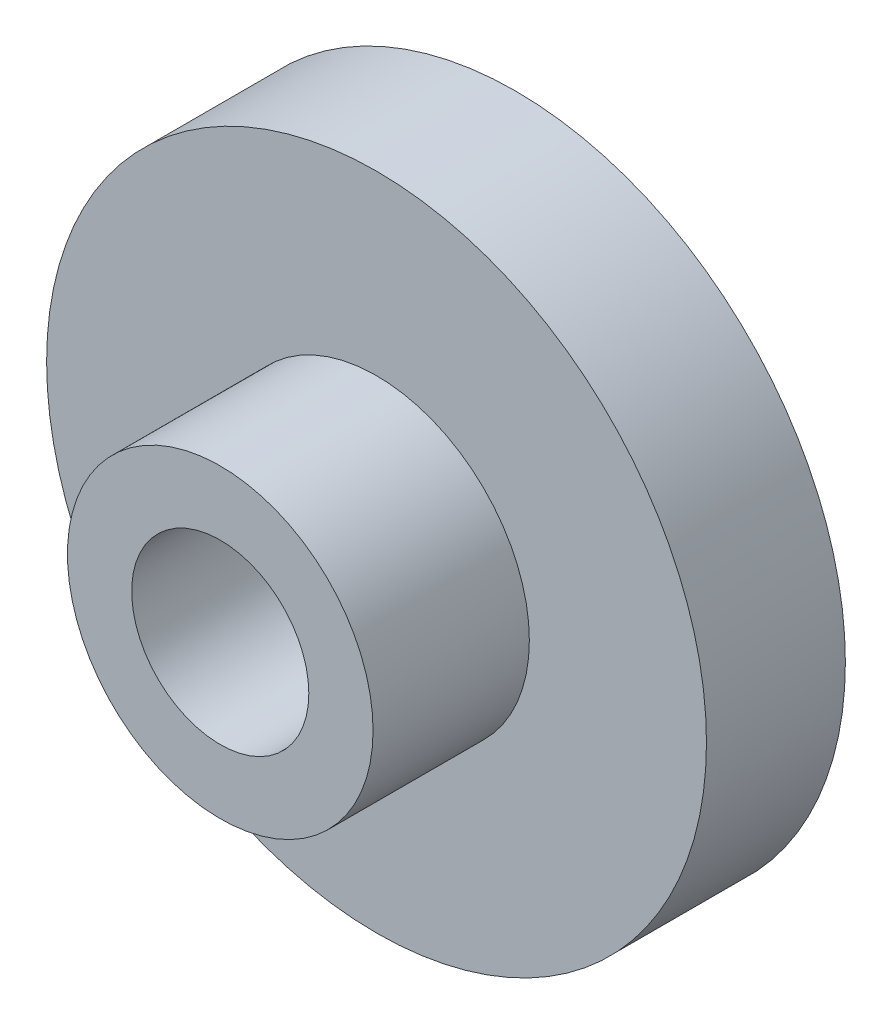
ISO-10303-21;
HEADER;
FILE_DESCRIPTION(('STEP AP214'),'2;1');
FILE_NAME('part.step','',(''),(''),'','','');
FILE_SCHEMA(('AUTOMOTIVE_DESIGN { 1 0 10303 214 1 1 1 1 }'));
ENDSEC;
DATA;
#1=APPLICATION_CONTEXT('core data for automotive mechanical design processes');
#2=APPLICATION_PROTOCOL_DEFINITION('international standard','automotive_design',2000,#1);
#3=PRODUCT_CONTEXT('',#1,'mechanical');
#4=PRODUCT('Part','Part','',(#3));
#5=PRODUCT_RELATED_PRODUCT_CATEGORY('part','',(#4));
#6=PRODUCT_DEFINITION_FORMATION('','',#4);
#7=PRODUCT_DEFINITION_CONTEXT('part definition',#1,'design');
#8=PRODUCT_DEFINITION('design','',#6,#7);
#9=PRODUCT_DEFINITION_SHAPE('','',#8);
#10=(LENGTH_UNIT() NAMED_UNIT(*) SI_UNIT(.MILLI.,.METRE.));
#11=(NAMED_UNIT(*) PLANE_ANGLE_UNIT() SI_UNIT($,.RADIAN.));
#12=(NAMED_UNIT(*) SI_UNIT($,.STERADIAN.) SOLID_ANGLE_UNIT());
#13=UNCERTAINTY_MEASURE_WITH_UNIT(LENGTH_MEASURE(1.E-05),#10,'distance_accuracy_value','');
#14=(GEOMETRIC_REPRESENTATION_CONTEXT(3) GLOBAL_UNCERTAINTY_ASSIGNED_CONTEXT((#13)) GLOBAL_UNIT_ASSIGNED_CONTEXT((#10,
#11,#12)) REPRESENTATION_CONTEXT('',''));
#15=CARTESIAN_POINT('',(0.,0.,0.));
#16=DIRECTION('',(0.,0.,1.));
#17=DIRECTION('',(1.,0.,0.));
#18=AXIS2_PLACEMENT_3D('',#15,#16,#17);
#19=CARTESIAN_POINT('',(0.,0.,2.));
#20=DIRECTION('',(0.,0.,-1.));
#21=DIRECTION('',(-1.,0.,0.));
#22=AXIS2_PLACEMENT_3D('',#19,#20,#21);
#23=CYLINDRICAL_SURFACE('',#22,4.75);
#24=CARTESIAN_POINT('',(0.,0.,2.));
#25=DIRECTION('',(0.,0.,1.));
#26=DIRECTION('',(1.,0.,0.));
#27=AXIS2_PLACEMENT_3D('',#24,#25,#26);
#28=CIRCLE('',#27,4.75);
#29=CARTESIAN_POINT('',(4.75,0.,2.));
#30=VERTEX_POINT('',#29);
#31=EDGE_CURVE('E52',#30,#30,#28,.T.);
#32=ORIENTED_EDGE('',*,*,#31,.F.);
#33=EDGE_LOOP('',(#32));
#34=FACE_BOUND('',#33,.T.);
#35=CARTESIAN_POINT('',(0.,0.,0.));
#36=DIRECTION('',(0.,0.,1.));
#37=DIRECTION('',(1.,0.,0.));
#38=AXIS2_PLACEMENT_3D('',#35,#36,#37);
#39=CIRCLE('',#38,4.75);
#40=CARTESIAN_POINT('',(4.75,0.,0.));
#41=VERTEX_POINT('',#40);
#42=EDGE_CURVE('E63',#41,#41,#39,.T.);
#43=ORIENTED_EDGE('',*,*,#42,.T.);
#44=EDGE_LOOP('',(#43));
#45=FACE_BOUND('',#44,.T.);
#46=ADVANCED_FACE('F45',(#34,#45),#23,.T.);
#47=CARTESIAN_POINT('',(0.,0.,2.));
#48=DIRECTION('',(0.,0.,1.));
#49=DIRECTION('',(1.,0.,0.));
#50=AXIS2_PLACEMENT_3D('',#47,#48,#49);
#51=PLANE('',#50);
#52=CARTESIAN_POINT('',(0.,0.,2.));
#53=DIRECTION('',(0.,0.,1.));
#54=DIRECTION('',(1.,0.,0.));
#55=AXIS2_PLACEMENT_3D('',#52,#53,#54);
#56=CIRCLE('',#55,2.2);
#57=CARTESIAN_POINT('',(2.2,0.,2.));
#58=VERTEX_POINT('',#57);
#59=EDGE_CURVE('E57',#58,#58,#56,.T.);
#60=ORIENTED_EDGE('',*,*,#59,.F.);
#61=EDGE_LOOP('',(#60));
#62=FACE_BOUND('',#61,.T.);
#63=ORIENTED_EDGE('',*,*,#31,.T.);
#64=EDGE_LOOP('',(#63));
#65=FACE_BOUND('',#64,.T.);
#66=ADVANCED_FACE('F96',(#62,#65),#51,.T.);
#67=CARTESIAN_POINT('',(0.,0.,0.));
#68=DIRECTION('',(0.,0.,1.));
#69=DIRECTION('',(1.,0.,0.));
#70=AXIS2_PLACEMENT_3D('',#67,#68,#69);
#71=PLANE('',#70);
#72=ORIENTED_EDGE('',*,*,#42,.F.);
#73=EDGE_LOOP('',(#72));
#74=FACE_BOUND('',#73,.T.);
#75=ADVANCED_FACE('F101',(#74),#71,.F.);
#76=CARTESIAN_POINT('',(0.,0.,4.25));
#77=DIRECTION('',(0.,0.,-1.));
#78=DIRECTION('',(-1.,0.,0.));
#79=AXIS2_PLACEMENT_3D('',#76,#77,#78);
#80=CYLINDRICAL_SURFACE('',#79,1.275);
#81=CARTESIAN_POINT('',(0.,0.,2.));
#82=DIRECTION('',(0.,0.,1.));
#83=DIRECTION('',(1.,0.,0.));
#84=AXIS2_PLACEMENT_3D('',#81,#82,#83);
#85=CIRCLE('',#84,1.275);
#86=CARTESIAN_POINT('',(1.275,0.,2.));
#87=VERTEX_POINT('',#86);
#88=EDGE_CURVE('E11',#87,#87,#85,.T.);
#89=ORIENTED_EDGE('',*,*,#88,.F.);
#90=EDGE_LOOP('',(#89));
#91=FACE_BOUND('',#90,.T.);
#92=CARTESIAN_POINT('',(0.,0.,4.25));
#93=DIRECTION('',(0.,0.,1.));
#94=DIRECTION('',(1.,0.,0.));
#95=AXIS2_PLACEMENT_3D('',#92,#93,#94);
#96=CIRCLE('',#95,1.275);
#97=CARTESIAN_POINT('',(1.275,0.,4.25));
#98=VERTEX_POINT('',#97);
#99=EDGE_CURVE('E73',#98,#98,#96,.T.);
#100=ORIENTED_EDGE('',*,*,#99,.T.);
#101=EDGE_LOOP('',(#100));
#102=FACE_BOUND('',#101,.T.);
#103=ADVANCED_FACE('F81',(#91,#102),#80,.F.);
#104=CARTESIAN_POINT('',(0.,0.,4.25));
#105=DIRECTION('',(0.,0.,-1.));
#106=DIRECTION('',(-1.,0.,0.));
#107=AXIS2_PLACEMENT_3D('',#104,#105,#106);
#108=CYLINDRICAL_SURFACE('',#107,2.2);
#109=ORIENTED_EDGE('',*,*,#59,.T.);
#110=EDGE_LOOP('',(#109));
#111=FACE_BOUND('',#110,.T.);
#112=CARTESIAN_POINT('',(0.,0.,4.25));
#113=DIRECTION('',(0.,0.,1.));
#114=DIRECTION('',(1.,0.,0.));
#115=AXIS2_PLACEMENT_3D('',#112,#113,#114);
#116=CIRCLE('',#115,2.2);
#117=CARTESIAN_POINT('',(2.2,0.,4.25));
#118=VERTEX_POINT('',#117);
#119=EDGE_CURVE('E68',#118,#118,#116,.T.);
#120=ORIENTED_EDGE('',*,*,#119,.F.);
#121=EDGE_LOOP('',(#120));
#122=FACE_BOUND('',#121,.T.);
#123=ADVANCED_FACE('F86',(#111,#122),#108,.T.);
#124=CARTESIAN_POINT('',(0.,0.,4.25));
#125=DIRECTION('',(0.,0.,1.));
#126=DIRECTION('',(1.,0.,0.));
#127=AXIS2_PLACEMENT_3D('',#124,#125,#126);
#128=PLANE('',#127);
#129=ORIENTED_EDGE('',*,*,#99,.F.);
#130=EDGE_LOOP('',(#129));
#131=FACE_BOUND('',#130,.T.);
#132=ORIENTED_EDGE('',*,*,#119,.T.);
#133=EDGE_LOOP('',(#132));
#134=FACE_BOUND('',#133,.T.);
#135=ADVANCED_FACE('F83',(#131,#134),#128,.T.);
#136=CARTESIAN_POINT('',(0.,0.,2.));
#137=DIRECTION('',(0.,0.,1.));
#138=DIRECTION('',(1.,0.,0.));
#139=AXIS2_PLACEMENT_3D('',#136,#137,#138);
#140=PLANE('',#139);
#141=ORIENTED_EDGE('',*,*,#88,.T.);
#142=EDGE_LOOP('',(#141));
#143=FACE_BOUND('',#142,.T.);
#144=ADVANCED_FACE('F85',(#143),#140,.T.);
#145=CLOSED_SHELL('',(#46,#66,#75,#103,#123,#135,#144));
#146=MANIFOLD_SOLID_BREP('B2',#145);
#147=ADVANCED_BREP_SHAPE_REPRESENTATION('',(#18,#146),#14);
#148=SHAPE_DEFINITION_REPRESENTATION(#9,#147);
ENDSEC;
END-ISO-10303-21;
